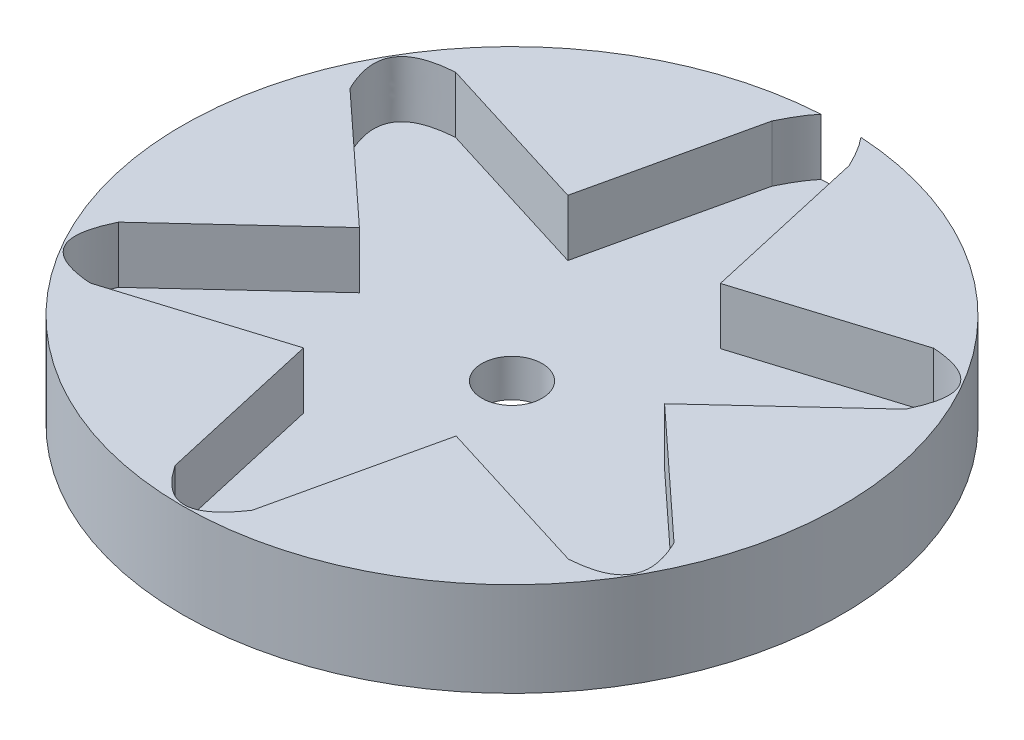
ISO-10303-21;
HEADER;
FILE_DESCRIPTION(('STEP AP214'),'2;1');
FILE_NAME('part.step','',(''),(''),'','','');
FILE_SCHEMA(('AUTOMOTIVE_DESIGN { 1 0 10303 214 1 1 1 1 }'));
ENDSEC;
DATA;
#1=APPLICATION_CONTEXT('core data for automotive mechanical design processes');
#2=APPLICATION_PROTOCOL_DEFINITION('international standard','automotive_design',2000,#1);
#3=PRODUCT_CONTEXT('',#1,'mechanical');
#4=PRODUCT('Part','Part','',(#3));
#5=PRODUCT_RELATED_PRODUCT_CATEGORY('part','',(#4));
#6=PRODUCT_DEFINITION_FORMATION('','',#4);
#7=PRODUCT_DEFINITION_CONTEXT('part definition',#1,'design');
#8=PRODUCT_DEFINITION('design','',#6,#7);
#9=PRODUCT_DEFINITION_SHAPE('','',#8);
#10=(LENGTH_UNIT() NAMED_UNIT(*) SI_UNIT(.MILLI.,.METRE.));
#11=(NAMED_UNIT(*) PLANE_ANGLE_UNIT() SI_UNIT($,.RADIAN.));
#12=(NAMED_UNIT(*) SI_UNIT($,.STERADIAN.) SOLID_ANGLE_UNIT());
#13=UNCERTAINTY_MEASURE_WITH_UNIT(LENGTH_MEASURE(1.E-05),#10,'distance_accuracy_value','');
#14=(GEOMETRIC_REPRESENTATION_CONTEXT(3) GLOBAL_UNCERTAINTY_ASSIGNED_CONTEXT((#13)) GLOBAL_UNIT_ASSIGNED_CONTEXT((#10,
#11,#12)) REPRESENTATION_CONTEXT('',''));
#15=CARTESIAN_POINT('',(0.,0.,0.));
#16=DIRECTION('',(0.,0.,1.));
#17=DIRECTION('',(1.,0.,0.));
#18=AXIS2_PLACEMENT_3D('',#15,#16,#17);
#19=CARTESIAN_POINT('',(0.,10.,0.));
#20=DIRECTION('',(0.,-1.,0.));
#21=DIRECTION('',(0.,0.,-1.));
#22=AXIS2_PLACEMENT_3D('',#19,#20,#21);
#23=CYLINDRICAL_SURFACE('',#22,17.5);
#24=CARTESIAN_POINT('',(0.,7.00000000000001,0.));
#25=DIRECTION('',(0.,-1.,0.));
#26=DIRECTION('',(0.,0.,-1.));
#27=AXIS2_PLACEMENT_3D('',#24,#25,#26);
#28=CIRCLE('',#27,17.5);
#29=CARTESIAN_POINT('',(-1.06104952952811,7.00000000000001,-17.4678039231006));
#30=VERTEX_POINT('',#29);
#31=CARTESIAN_POINT('',(1.06104952959056,7.00000000000001,-17.4678039230968));
#32=VERTEX_POINT('',#31);
#33=EDGE_CURVE('E11',#30,#32,#28,.T.);
#34=ORIENTED_EDGE('',*,*,#33,.T.);
#35=DIRECTION('',(0.,1.,0.));
#36=VECTOR('',#35,1.);
#37=CARTESIAN_POINT('',(1.06104952959056,7.00000000000001,-17.4678039230968));
#38=LINE('',#37,#36);
#39=CARTESIAN_POINT('',(1.06104952959056,10.,-17.4678039230968));
#40=VERTEX_POINT('',#39);
#41=EDGE_CURVE('E273',#32,#40,#38,.T.);
#42=ORIENTED_EDGE('',*,*,#41,.T.);
#43=CARTESIAN_POINT('',(0.,10.,0.));
#44=DIRECTION('',(0.,1.,0.));
#45=DIRECTION('',(0.,0.,1.));
#46=AXIS2_PLACEMENT_3D('',#43,#44,#45);
#47=CIRCLE('',#46,17.5);
#48=CARTESIAN_POINT('',(-1.06104952952811,10.,-17.4678039231006));
#49=VERTEX_POINT('',#48);
#50=EDGE_CURVE('E260',#49,#40,#47,.T.);
#51=ORIENTED_EDGE('',*,*,#50,.F.);
#52=DIRECTION('',(0.,1.,0.));
#53=VECTOR('',#52,1.);
#54=CARTESIAN_POINT('',(-1.06104952952811,7.00000000000001,-17.4678039231006));
#55=LINE('',#54,#53);
#56=EDGE_CURVE('E272',#49,#30,#55,.F.);
#57=ORIENTED_EDGE('',*,*,#56,.T.);
#58=EDGE_LOOP('',(#34,#42,#51,#57));
#59=FACE_BOUND('',#58,.T.);
#60=CARTESIAN_POINT('',(0.,5.,0.));
#61=DIRECTION('',(0.,-1.,0.));
#62=DIRECTION('',(0.,0.,-1.));
#63=AXIS2_PLACEMENT_3D('',#60,#61,#62);
#64=CIRCLE('',#63,17.5);
#65=CARTESIAN_POINT('',(0.,5.,-17.5));
#66=VERTEX_POINT('',#65);
#67=EDGE_CURVE('E218',#66,#66,#64,.T.);
#68=ORIENTED_EDGE('',*,*,#67,.F.);
#69=EDGE_LOOP('',(#68));
#70=FACE_BOUND('',#69,.T.);
#71=ADVANCED_FACE('F49',(#59,#70),#23,.T.);
#72=CARTESIAN_POINT('',(0.,10.,0.));
#73=DIRECTION('',(0.,1.,0.));
#74=DIRECTION('',(0.,0.,1.));
#75=AXIS2_PLACEMENT_3D('',#72,#73,#74);
#76=PLANE('',#75);
#77=CARTESIAN_POINT('',(2.05053814510281,10.,-15.8532222673604));
#78=CARTESIAN_POINT('',(1.23713778191181,10.,-17.5523034470157));
#79=CARTESIAN_POINT('',(3.05311331771918E-11,10.,-18.2086801576229));
#80=CARTESIAN_POINT('',(-1.23713778185253,10.,-17.552303447016));
#81=CARTESIAN_POINT('',(-2.05053814504663,10.,-15.8532222673604));
#82=B_SPLINE_CURVE_WITH_KNOTS('',2,(#77,#78,#79,#80,#81),.UNSPECIFIED.,.F.,.F.,(3,1,1,3),
(0.00107426854361692,0.375268567135908,0.624731432864102,0.998925731456393),.UNSPECIFIED.);
#83=CARTESIAN_POINT('',(-2.05053814504663,10.,-15.8532222673604));
#84=VERTEX_POINT('',#83);
#85=EDGE_CURVE('E58',#49,#84,#82,.T.);
#86=ORIENTED_EDGE('',*,*,#85,.F.);
#87=ORIENTED_EDGE('',*,*,#50,.T.);
#88=CARTESIAN_POINT('',(2.05053814510281,10.,-15.8532222673604));
#89=CARTESIAN_POINT('',(1.23713778191181,10.,-17.5523034470157));
#90=CARTESIAN_POINT('',(3.05311331771918E-11,10.,-18.2086801576229));
#91=CARTESIAN_POINT('',(-1.23713778185253,10.,-17.552303447016));
#92=CARTESIAN_POINT('',(-2.05053814504663,10.,-15.8532222673604));
#93=B_SPLINE_CURVE_WITH_KNOTS('',2,(#88,#89,#90,#91,#92),.UNSPECIFIED.,.F.,.F.,(3,1,1,3),
(0.00107426854361692,0.375268567135908,0.624731432864102,0.998925731456393),.UNSPECIFIED.);
#94=CARTESIAN_POINT('',(2.05053814510281,10.,-15.8532222673606));
#95=VERTEX_POINT('',#94);
#96=EDGE_CURVE('E346',#95,#40,#93,.T.);
#97=ORIENTED_EDGE('',*,*,#96,.F.);
#98=DIRECTION('',(-0.220846052867144,0.,-0.975308679820395));
#99=VECTOR('',#98,1.);
#100=CARTESIAN_POINT('',(4.05135282122782,10.,-7.01714892576155));
#101=LINE('',#100,#99);
#102=CARTESIAN_POINT('',(4.05135282122782,10.,-7.01714892576155));
#103=VERTEX_POINT('',#102);
#104=EDGE_CURVE('E350',#103,#95,#101,.T.);
#105=ORIENTED_EDGE('',*,*,#104,.F.);
#106=DIRECTION('',(-0.955065119689509,0.,0.296396047801693));
#107=VECTOR('',#106,1.);
#108=CARTESIAN_POINT('',(12.6967320380275,10.,-9.70016621827807));
#109=LINE('',#108,#107);
#110=CARTESIAN_POINT('',(12.6967320380275,10.,-9.70016621827807));
#111=VERTEX_POINT('',#110);
#112=EDGE_CURVE('E357',#111,#103,#109,.T.);
#113=ORIENTED_EDGE('',*,*,#112,.F.);
#114=CARTESIAN_POINT('',(14.7489563849404,10.,-6.14560938089559));
#115=CARTESIAN_POINT('',(15.3726854341846,10.,-7.42841556478302));
#116=CARTESIAN_POINT('',(15.149524439763,10.,-8.74658201343403));
#117=CARTESIAN_POINT('',(14.1195393060261,10.,-9.59892832806064));
#118=CARTESIAN_POINT('',(12.6967320380275,10.,-9.70016621827807));
#119=B_SPLINE_CURVE_WITH_KNOTS('',2,(#114,#115,#116,#117,#118),.UNSPECIFIED.,.F.,.F.,(3,1,1,3),
(0.00239909876569032,0.375599774691409,0.624400225308554,0.997600901234272),.UNSPECIFIED.);
#120=CARTESIAN_POINT('',(14.7489563849397,10.,-6.14560938089537));
#121=VERTEX_POINT('',#120);
#122=EDGE_CURVE('E361',#121,#111,#119,.T.);
#123=ORIENTED_EDGE('',*,*,#122,.F.);
#124=DIRECTION('',(0.73421906682237,0.,-0.678912632018648));
#125=VECTOR('',#124,1.);
#126=CARTESIAN_POINT('',(8.10270564242743,10.,-5.57331958361829E-11));
#127=LINE('',#126,#125);
#128=CARTESIAN_POINT('',(8.10270564242743,10.,-5.57331958361829E-11));
#129=VERTEX_POINT('',#128);
#130=EDGE_CURVE('E367',#129,#121,#127,.T.);
#131=ORIENTED_EDGE('',*,*,#130,.F.);
#132=DIRECTION('',(-0.734219066822367,0.,-0.678912632018651));
#133=VECTOR('',#132,1.);
#134=CARTESIAN_POINT('',(14.7489563849403,10.,6.14560938078457));
#135=LINE('',#134,#133);
#136=CARTESIAN_POINT('',(14.7489563849403,10.,6.14560938078457));
#137=VERTEX_POINT('',#136);
#138=EDGE_CURVE('E374',#137,#129,#135,.T.);
#139=ORIENTED_EDGE('',*,*,#138,.F.);
#140=CARTESIAN_POINT('',(12.6967320380278,10.,9.70016621816705));
#141=CARTESIAN_POINT('',(14.1195393060658,10.,9.59892832796583));
#142=CARTESIAN_POINT('',(15.1495244398164,10.,8.74658201334766));
#143=CARTESIAN_POINT('',(15.3726854342223,10.,7.42841556469109));
#144=CARTESIAN_POINT('',(14.7489563849403,10.,6.14560938078457));
#145=B_SPLINE_CURVE_WITH_KNOTS('',2,(#140,#141,#142,#143,#144),.UNSPECIFIED.,.F.,.F.,(3,1,1,3),
(0.00239909876554578,0.375599774691407,0.624400225308648,0.997600901234509),.UNSPECIFIED.);
#146=CARTESIAN_POINT('',(12.6967320380278,10.,9.70016621816705));
#147=VERTEX_POINT('',#146);
#148=EDGE_CURVE('E378',#147,#137,#145,.T.);
#149=ORIENTED_EDGE('',*,*,#148,.F.);
#150=DIRECTION('',(0.95506511968948,0.,0.296396047801788));
#151=VECTOR('',#150,1.);
#152=CARTESIAN_POINT('',(4.05135282122759,10.,7.01714892564942));
#153=LINE('',#152,#151);
#154=CARTESIAN_POINT('',(4.05135282122759,10.,7.01714892564942));
#155=VERTEX_POINT('',#154);
#156=EDGE_CURVE('E384',#155,#147,#153,.T.);
#157=ORIENTED_EDGE('',*,*,#156,.F.);
#158=DIRECTION('',(0.220846052867143,0.,-0.975308679820395));
#159=VECTOR('',#158,1.);
#160=CARTESIAN_POINT('',(2.05222434693997,10.,15.845775599008));
#161=LINE('',#160,#159);
#162=CARTESIAN_POINT('',(2.05222434693997,10.,15.845775599008));
#163=VERTEX_POINT('',#162);
#164=EDGE_CURVE('E391',#163,#155,#161,.T.);
#165=ORIENTED_EDGE('',*,*,#164,.F.);
#166=CARTESIAN_POINT('',(-2.05222434688435,10.,15.845775599008));
#167=CARTESIAN_POINT('',(-1.25314612813476,10.,17.0273438927573));
#168=CARTESIAN_POINT('',(1.66533453693773E-11,10.,17.4931640268106));
#169=CARTESIAN_POINT('',(1.25314612817518,10.,17.0273438927571));
#170=CARTESIAN_POINT('',(2.05222434693997,10.,15.845775599008));
#171=B_SPLINE_CURVE_WITH_KNOTS('',2,(#166,#167,#168,#169,#170),.UNSPECIFIED.,.F.,.F.,(3,1,1,3),
(0.00239909876539665,0.375599774691334,0.624400225308626,0.997600901234563),.UNSPECIFIED.);
#172=CARTESIAN_POINT('',(-2.05222434688435,10.,15.8457755990085));
#173=VERTEX_POINT('',#172);
#174=EDGE_CURVE('E395',#173,#163,#171,.T.);
#175=ORIENTED_EDGE('',*,*,#174,.F.);
#176=DIRECTION('',(0.220846052867121,0.,0.975308679820401));
#177=VECTOR('',#176,1.);
#178=CARTESIAN_POINT('',(-4.05135282117186,10.,7.01714892564942));
#179=LINE('',#178,#177);
#180=CARTESIAN_POINT('',(-4.05135282117186,10.,7.01714892564942));
#181=VERTEX_POINT('',#180);
#182=EDGE_CURVE('E401',#181,#173,#179,.T.);
#183=ORIENTED_EDGE('',*,*,#182,.F.);
#184=DIRECTION('',(0.955065119689503,0.,-0.296396047801714));
#185=VECTOR('',#184,1.);
#186=CARTESIAN_POINT('',(-12.6967320379737,10.,9.70016621816683));
#187=LINE('',#186,#185);
#188=CARTESIAN_POINT('',(-12.6967320379737,10.,9.70016621816683));
#189=VERTEX_POINT('',#188);
#190=EDGE_CURVE('E408',#189,#181,#187,.T.);
#191=ORIENTED_EDGE('',*,*,#190,.F.);
#192=CARTESIAN_POINT('',(-14.748956384886,10.,6.14560938078523));
#193=CARTESIAN_POINT('',(-15.3726854341882,10.,7.42841556472973));
#194=CARTESIAN_POINT('',(-15.14952443979,10.,8.74658201339984));
#195=CARTESIAN_POINT('',(-14.119539306033,10.,9.59892832800247));
#196=CARTESIAN_POINT('',(-12.6967320379737,10.,9.70016621816683));
#197=B_SPLINE_CURVE_WITH_KNOTS('',2,(#192,#193,#194,#195,#196),.UNSPECIFIED.,.F.,.F.,(3,1,1,3),
(0.0023990987654635,0.375599774691405,0.624400225308699,0.99760090123464),.UNSPECIFIED.);
#198=CARTESIAN_POINT('',(-14.7489563848848,10.,6.14560938078457));
#199=VERTEX_POINT('',#198);
#200=EDGE_CURVE('E412',#199,#189,#197,.T.);
#201=ORIENTED_EDGE('',*,*,#200,.F.);
#202=DIRECTION('',(-0.73421906682236,0.,0.678912632018659));
#203=VECTOR('',#202,1.);
#204=CARTESIAN_POINT('',(-8.10270564237159,10.,-5.61772850460329E-11));
#205=LINE('',#204,#203);
#206=CARTESIAN_POINT('',(-8.10270564237159,10.,-5.61772850460329E-11));
#207=VERTEX_POINT('',#206);
#208=EDGE_CURVE('E418',#207,#199,#205,.T.);
#209=ORIENTED_EDGE('',*,*,#208,.F.);
#210=DIRECTION('',(0.734219066822346,0.,0.678912632018673));
#211=VECTOR('',#210,1.);
#212=CARTESIAN_POINT('',(-14.748956384885,10.,-6.14560938089737));
#213=LINE('',#212,#211);
#214=CARTESIAN_POINT('',(-14.748956384885,10.,-6.14560938089737));
#215=VERTEX_POINT('',#214);
#216=EDGE_CURVE('E65',#215,#207,#213,.T.);
#217=ORIENTED_EDGE('',*,*,#216,.F.);
#218=CARTESIAN_POINT('',(-12.6967320379726,10.,-9.70016621827963));
#219=CARTESIAN_POINT('',(-14.1195393060227,10.,-9.59892832804754));
#220=CARTESIAN_POINT('',(-15.1495244397788,10.,-8.74658201341405));
#221=CARTESIAN_POINT('',(-15.3726854341788,10.,-7.42841556477147));
#222=CARTESIAN_POINT('',(-14.748956384885,10.,-6.14560938089737));
#223=B_SPLINE_CURVE_WITH_KNOTS('',2,(#218,#219,#220,#221,#222),.UNSPECIFIED.,.F.,.F.,(3,1,1,3),
(0.00239909876565966,0.375599774691492,0.624400225308713,0.997600901234545),.UNSPECIFIED.);
#224=CARTESIAN_POINT('',(-12.6967320379707,10.,-9.70016621827852));
#225=VERTEX_POINT('',#224);
#226=EDGE_CURVE('E209',#225,#215,#223,.T.);
#227=ORIENTED_EDGE('',*,*,#226,.F.);
#228=DIRECTION('',(-0.95506511968949,0.,-0.296396047801756));
#229=VECTOR('',#228,1.);
#230=CARTESIAN_POINT('',(-4.05135282117164,10.,-7.01714892576155));
#231=LINE('',#230,#229);
#232=CARTESIAN_POINT('',(-4.05135282117164,10.,-7.01714892576155));
#233=VERTEX_POINT('',#232);
#234=EDGE_CURVE('E215',#233,#225,#231,.T.);
#235=ORIENTED_EDGE('',*,*,#234,.F.);
#236=DIRECTION('',(-0.220846052867149,0.,0.975308679820394));
#237=VECTOR('',#236,1.);
#238=CARTESIAN_POINT('',(-2.05053814504663,10.,-15.8532222673604));
#239=LINE('',#238,#237);
#240=EDGE_CURVE('E263',#84,#233,#239,.T.);
#241=ORIENTED_EDGE('',*,*,#240,.F.);
#242=EDGE_LOOP('',(#86,#87,#97,#105,#113,#123,#131,#139,#149,#157,#165,#175,#183,#191,#201,#209,
#217,#227,#235,#241));
#243=FACE_BOUND('',#242,.T.);
#244=ADVANCED_FACE('F245',(#243),#76,.T.);
#245=CARTESIAN_POINT('',(-15.0688420258541,7.00000000000001,8.69999999999309));
#246=DIRECTION('',(0.,-1.,0.));
#247=DIRECTION('',(0.,0.,-1.));
#248=AXIS2_PLACEMENT_3D('',#245,#246,#247);
#249=PLANE('',#248);
#250=CARTESIAN_POINT('',(0.,7.00000000000001,0.));
#251=DIRECTION('',(0.,1.,0.));
#252=DIRECTION('',(0.,0.,1.));
#253=AXIS2_PLACEMENT_3D('',#250,#251,#252);
#254=CIRCLE('',#253,1.6);
#255=CARTESIAN_POINT('',(0.,7.00000000000001,1.6));
#256=VERTEX_POINT('',#255);
#257=EDGE_CURVE('E719',#256,#256,#254,.T.);
#258=ORIENTED_EDGE('',*,*,#257,.F.);
#259=EDGE_LOOP('',(#258));
#260=FACE_BOUND('',#259,.T.);
#261=CARTESIAN_POINT('',(2.05053814510281,7.00000000000001,-15.8532222673604));
#262=CARTESIAN_POINT('',(1.23713778191181,7.00000000000001,-17.5523034470157));
#263=CARTESIAN_POINT('',(3.05311331771918E-11,7.00000000000001,-18.2086801576229));
#264=CARTESIAN_POINT('',(-1.23713778185253,7.00000000000001,-17.552303447016));
#265=CARTESIAN_POINT('',(-2.05053814504663,7.00000000000001,-15.8532222673604));
#266=B_SPLINE_CURVE_WITH_KNOTS('',2,(#261,#262,#263,#264,#265),.UNSPECIFIED.,.F.,.F.,(3,1,1,3),
(0.00107426854361692,0.375268567135908,0.624731432864102,0.998925731456393),.UNSPECIFIED.);
#267=CARTESIAN_POINT('',(-2.05053814504663,7.00000000000001,-15.8532222673604));
#268=VERTEX_POINT('',#267);
#269=EDGE_CURVE('E462',#30,#268,#266,.T.);
#270=ORIENTED_EDGE('',*,*,#269,.T.);
#271=DIRECTION('',(-0.220846052867149,0.,0.975308679820394));
#272=VECTOR('',#271,1.);
#273=CARTESIAN_POINT('',(-2.05053814504663,7.00000000000001,-15.8532222673604));
#274=LINE('',#273,#272);
#275=CARTESIAN_POINT('',(-4.05135282117164,7.00000000000001,-7.01714892576155));
#276=VERTEX_POINT('',#275);
#277=EDGE_CURVE('E461',#268,#276,#274,.T.);
#278=ORIENTED_EDGE('',*,*,#277,.T.);
#279=DIRECTION('',(-0.95506511968949,0.,-0.296396047801756));
#280=VECTOR('',#279,1.);
#281=CARTESIAN_POINT('',(-4.05135282117164,7.00000000000001,-7.01714892576155));
#282=LINE('',#281,#280);
#283=CARTESIAN_POINT('',(-12.6967320379707,7.00000000000001,-9.70016621827852));
#284=VERTEX_POINT('',#283);
#285=EDGE_CURVE('E431',#276,#284,#282,.T.);
#286=ORIENTED_EDGE('',*,*,#285,.T.);
#287=CARTESIAN_POINT('',(-12.6967320379726,7.00000000000001,-9.70016621827963));
#288=CARTESIAN_POINT('',(-14.1195393060227,7.00000000000001,-9.59892832804754));
#289=CARTESIAN_POINT('',(-15.1495244397788,7.00000000000001,-8.74658201341405));
#290=CARTESIAN_POINT('',(-15.3726854341788,7.00000000000001,-7.42841556477147));
#291=CARTESIAN_POINT('',(-14.748956384885,7.00000000000001,-6.14560938089737));
#292=B_SPLINE_CURVE_WITH_KNOTS('',2,(#287,#288,#289,#290,#291),.UNSPECIFIED.,.F.,.F.,(3,1,1,3),
(0.00239909876565966,0.375599774691492,0.624400225308713,0.997600901234545),.UNSPECIFIED.);
#293=CARTESIAN_POINT('',(-14.748956384885,7.00000000000001,-6.14560938089737));
#294=VERTEX_POINT('',#293);
#295=EDGE_CURVE('E195',#284,#294,#292,.T.);
#296=ORIENTED_EDGE('',*,*,#295,.T.);
#297=DIRECTION('',(0.734219066822346,0.,0.678912632018673));
#298=VECTOR('',#297,1.);
#299=CARTESIAN_POINT('',(-14.748956384885,7.00000000000001,-6.14560938089737));
#300=LINE('',#299,#298);
#301=CARTESIAN_POINT('',(-8.10270564237159,7.00000000000001,-5.61772850460329E-11));
#302=VERTEX_POINT('',#301);
#303=EDGE_CURVE('E188',#294,#302,#300,.T.);
#304=ORIENTED_EDGE('',*,*,#303,.T.);
#305=DIRECTION('',(-0.73421906682236,0.,0.678912632018659));
#306=VECTOR('',#305,1.);
#307=CARTESIAN_POINT('',(-8.10270564237159,7.00000000000001,-5.61772850460329E-11));
#308=LINE('',#307,#306);
#309=CARTESIAN_POINT('',(-14.7489563848848,7.00000000000001,6.14560938078457));
#310=VERTEX_POINT('',#309);
#311=EDGE_CURVE('E198',#302,#310,#308,.T.);
#312=ORIENTED_EDGE('',*,*,#311,.T.);
#313=CARTESIAN_POINT('',(-14.748956384886,7.00000000000001,6.14560938078523));
#314=CARTESIAN_POINT('',(-15.3726854341882,7.00000000000001,7.42841556472973));
#315=CARTESIAN_POINT('',(-15.14952443979,7.00000000000001,8.74658201339984));
#316=CARTESIAN_POINT('',(-14.119539306033,7.00000000000001,9.59892832800247));
#317=CARTESIAN_POINT('',(-12.6967320379737,7.00000000000001,9.70016621816683));
#318=B_SPLINE_CURVE_WITH_KNOTS('',2,(#313,#314,#315,#316,#317),.UNSPECIFIED.,.F.,.F.,(3,1,1,3),
(0.0023990987654635,0.375599774691405,0.624400225308699,0.99760090123464),.UNSPECIFIED.);
#319=CARTESIAN_POINT('',(-12.6967320379737,7.00000000000001,9.70016621816683));
#320=VERTEX_POINT('',#319);
#321=EDGE_CURVE('E203',#310,#320,#318,.T.);
#322=ORIENTED_EDGE('',*,*,#321,.T.);
#323=DIRECTION('',(0.955065119689503,0.,-0.296396047801714));
#324=VECTOR('',#323,1.);
#325=CARTESIAN_POINT('',(-12.6967320379737,7.00000000000001,9.70016621816683));
#326=LINE('',#325,#324);
#327=CARTESIAN_POINT('',(-4.05135282117186,7.00000000000001,7.01714892564942));
#328=VERTEX_POINT('',#327);
#329=EDGE_CURVE('E226',#320,#328,#326,.T.);
#330=ORIENTED_EDGE('',*,*,#329,.T.);
#331=DIRECTION('',(0.220846052867121,0.,0.975308679820401));
#332=VECTOR('',#331,1.);
#333=CARTESIAN_POINT('',(-4.05135282117186,7.00000000000001,7.01714892564942));
#334=LINE('',#333,#332);
#335=CARTESIAN_POINT('',(-2.05222434688435,7.00000000000001,15.8457755990085));
#336=VERTEX_POINT('',#335);
#337=EDGE_CURVE('E483',#328,#336,#334,.T.);
#338=ORIENTED_EDGE('',*,*,#337,.T.);
#339=CARTESIAN_POINT('',(-2.05222434688435,7.00000000000001,15.845775599008));
#340=CARTESIAN_POINT('',(-1.25314612813476,7.00000000000001,17.0273438927573));
#341=CARTESIAN_POINT('',(1.66533453693773E-11,7.00000000000001,17.4931640268106));
#342=CARTESIAN_POINT('',(1.25314612817518,7.00000000000001,17.0273438927571));
#343=CARTESIAN_POINT('',(2.05222434693997,7.00000000000001,15.845775599008));
#344=B_SPLINE_CURVE_WITH_KNOTS('',2,(#339,#340,#341,#342,#343),.UNSPECIFIED.,.F.,.F.,(3,1,1,3),
(0.00239909876539665,0.375599774691334,0.624400225308626,0.997600901234563),.UNSPECIFIED.);
#345=CARTESIAN_POINT('',(2.05222434693997,7.00000000000001,15.845775599008));
#346=VERTEX_POINT('',#345);
#347=EDGE_CURVE('E487',#336,#346,#344,.T.);
#348=ORIENTED_EDGE('',*,*,#347,.T.);
#349=DIRECTION('',(0.220846052867143,0.,-0.975308679820395));
#350=VECTOR('',#349,1.);
#351=CARTESIAN_POINT('',(2.05222434693997,7.00000000000001,15.845775599008));
#352=LINE('',#351,#350);
#353=CARTESIAN_POINT('',(4.05135282122759,7.00000000000001,7.01714892564942));
#354=VERTEX_POINT('',#353);
#355=EDGE_CURVE('E489',#346,#354,#352,.T.);
#356=ORIENTED_EDGE('',*,*,#355,.T.);
#357=DIRECTION('',(0.95506511968948,0.,0.296396047801788));
#358=VECTOR('',#357,1.);
#359=CARTESIAN_POINT('',(4.05135282122759,7.00000000000001,7.01714892564942));
#360=LINE('',#359,#358);
#361=CARTESIAN_POINT('',(12.6967320380278,7.00000000000001,9.70016621816705));
#362=VERTEX_POINT('',#361);
#363=EDGE_CURVE('E520',#354,#362,#360,.T.);
#364=ORIENTED_EDGE('',*,*,#363,.T.);
#365=CARTESIAN_POINT('',(12.6967320380278,7.00000000000001,9.70016621816705));
#366=CARTESIAN_POINT('',(14.1195393060658,7.00000000000001,9.59892832796583));
#367=CARTESIAN_POINT('',(15.1495244398164,7.00000000000001,8.74658201334766));
#368=CARTESIAN_POINT('',(15.3726854342223,7.00000000000001,7.42841556469109));
#369=CARTESIAN_POINT('',(14.7489563849403,7.00000000000001,6.14560938078457));
#370=B_SPLINE_CURVE_WITH_KNOTS('',2,(#365,#366,#367,#368,#369),.UNSPECIFIED.,.F.,.F.,(3,1,1,3),
(0.00239909876554578,0.375599774691407,0.624400225308648,0.997600901234509),.UNSPECIFIED.);
#371=CARTESIAN_POINT('',(14.7489563849403,7.00000000000001,6.14560938078457));
#372=VERTEX_POINT('',#371);
#373=EDGE_CURVE('E525',#362,#372,#370,.T.);
#374=ORIENTED_EDGE('',*,*,#373,.T.);
#375=DIRECTION('',(-0.734219066822367,0.,-0.678912632018651));
#376=VECTOR('',#375,1.);
#377=CARTESIAN_POINT('',(14.7489563849403,7.00000000000001,6.14560938078457));
#378=LINE('',#377,#376);
#379=CARTESIAN_POINT('',(8.10270564242743,7.00000000000001,-5.57331958361829E-11));
#380=VERTEX_POINT('',#379);
#381=EDGE_CURVE('E527',#372,#380,#378,.T.);
#382=ORIENTED_EDGE('',*,*,#381,.T.);
#383=DIRECTION('',(0.73421906682237,0.,-0.678912632018648));
#384=VECTOR('',#383,1.);
#385=CARTESIAN_POINT('',(8.10270564242743,7.00000000000001,-5.57331958361829E-11));
#386=LINE('',#385,#384);
#387=CARTESIAN_POINT('',(14.7489563849397,7.00000000000001,-6.14560938089537));
#388=VERTEX_POINT('',#387);
#389=EDGE_CURVE('E558',#380,#388,#386,.T.);
#390=ORIENTED_EDGE('',*,*,#389,.T.);
#391=CARTESIAN_POINT('',(14.7489563849404,7.00000000000001,-6.14560938089559));
#392=CARTESIAN_POINT('',(15.3726854341846,7.00000000000001,-7.42841556478302));
#393=CARTESIAN_POINT('',(15.149524439763,7.00000000000001,-8.74658201343403));
#394=CARTESIAN_POINT('',(14.1195393060261,7.00000000000001,-9.59892832806064));
#395=CARTESIAN_POINT('',(12.6967320380275,7.00000000000001,-9.70016621827807));
#396=B_SPLINE_CURVE_WITH_KNOTS('',2,(#391,#392,#393,#394,#395),.UNSPECIFIED.,.F.,.F.,(3,1,1,3),
(0.00239909876569032,0.375599774691409,0.624400225308554,0.997600901234272),.UNSPECIFIED.);
#397=CARTESIAN_POINT('',(12.6967320380275,7.00000000000001,-9.70016621827807));
#398=VERTEX_POINT('',#397);
#399=EDGE_CURVE('E563',#388,#398,#396,.T.);
#400=ORIENTED_EDGE('',*,*,#399,.T.);
#401=DIRECTION('',(-0.955065119689509,0.,0.296396047801693));
#402=VECTOR('',#401,1.);
#403=CARTESIAN_POINT('',(12.6967320380275,7.00000000000001,-9.70016621827807));
#404=LINE('',#403,#402);
#405=CARTESIAN_POINT('',(4.05135282122782,7.00000000000001,-7.01714892576155));
#406=VERTEX_POINT('',#405);
#407=EDGE_CURVE('E564',#398,#406,#404,.T.);
#408=ORIENTED_EDGE('',*,*,#407,.T.);
#409=DIRECTION('',(-0.220846052867144,0.,-0.975308679820395));
#410=VECTOR('',#409,1.);
#411=CARTESIAN_POINT('',(4.05135282122782,7.00000000000001,-7.01714892576155));
#412=LINE('',#411,#410);
#413=CARTESIAN_POINT('',(2.05053814510281,7.00000000000001,-15.8532222673606));
#414=VERTEX_POINT('',#413);
#415=EDGE_CURVE('E463',#406,#414,#412,.T.);
#416=ORIENTED_EDGE('',*,*,#415,.T.);
#417=EDGE_CURVE('E455',#414,#32,#266,.T.);
#418=ORIENTED_EDGE('',*,*,#417,.T.);
#419=ORIENTED_EDGE('',*,*,#33,.F.);
#420=EDGE_LOOP('',(#270,#278,#286,#296,#304,#312,#322,#330,#338,#348,#356,#364,#374,#382,#390,
#400,#408,#416,#418,#419));
#421=FACE_BOUND('',#420,.T.);
#422=ADVANCED_FACE('F205',(#260,#421),#249,.F.);
#423=DIRECTION('',(0.,1.,0.));
#424=VECTOR('',#423,1.);
#425=SURFACE_OF_LINEAR_EXTRUSION('',#266,#424);
#426=ORIENTED_EDGE('',*,*,#417,.F.);
#427=DIRECTION('',(0.,1.,0.));
#428=VECTOR('',#427,1.);
#429=CARTESIAN_POINT('',(2.05053814510281,7.00000000000001,-15.8532222673606));
#430=LINE('',#429,#428);
#431=EDGE_CURVE('E323',#414,#95,#430,.T.);
#432=ORIENTED_EDGE('',*,*,#431,.T.);
#433=ORIENTED_EDGE('',*,*,#96,.T.);
#434=ORIENTED_EDGE('',*,*,#41,.F.);
#435=EDGE_LOOP('',(#426,#432,#433,#434));
#436=FACE_BOUND('',#435,.T.);
#437=ADVANCED_FACE('F251',(#436),#425,.F.);
#438=ORIENTED_EDGE('',*,*,#85,.T.);
#439=DIRECTION('',(0.,1.,0.));
#440=VECTOR('',#439,1.);
#441=CARTESIAN_POINT('',(-2.05053814504663,7.00000000000001,-15.8532222673604));
#442=LINE('',#441,#440);
#443=EDGE_CURVE('E326',#268,#84,#442,.T.);
#444=ORIENTED_EDGE('',*,*,#443,.F.);
#445=ORIENTED_EDGE('',*,*,#269,.F.);
#446=ORIENTED_EDGE('',*,*,#56,.F.);
#447=EDGE_LOOP('',(#438,#444,#445,#446));
#448=FACE_BOUND('',#447,.T.);
#449=ADVANCED_FACE('F244',(#448),#425,.F.);
#450=CARTESIAN_POINT('',(-14.748956384885,7.00000000000001,-6.14560938089737));
#451=DIRECTION('',(-0.678912632018673,0.,0.734219066822346));
#452=DIRECTION('',(0.734219066822346,0.,0.678912632018673));
#453=AXIS2_PLACEMENT_3D('',#450,#451,#452);
#454=PLANE('',#453);
#455=ORIENTED_EDGE('',*,*,#216,.T.);
#456=DIRECTION('',(0.,1.,0.));
#457=VECTOR('',#456,1.);
#458=CARTESIAN_POINT('',(-8.10270564237159,7.00000000000001,-5.61772850460329E-11));
#459=LINE('',#458,#457);
#460=EDGE_CURVE('E184',#302,#207,#459,.T.);
#461=ORIENTED_EDGE('',*,*,#460,.F.);
#462=ORIENTED_EDGE('',*,*,#303,.F.);
#463=DIRECTION('',(0.,1.,0.));
#464=VECTOR('',#463,1.);
#465=CARTESIAN_POINT('',(-14.748956384885,7.00000000000001,-6.14560938089737));
#466=LINE('',#465,#464);
#467=EDGE_CURVE('E287',#294,#215,#466,.T.);
#468=ORIENTED_EDGE('',*,*,#467,.T.);
#469=EDGE_LOOP('',(#455,#461,#462,#468));
#470=FACE_BOUND('',#469,.T.);
#471=ADVANCED_FACE('F186',(#470),#454,.F.);
#472=DIRECTION('',(0.,1.,0.));
#473=VECTOR('',#472,1.);
#474=SURFACE_OF_LINEAR_EXTRUSION('',#292,#473);
#475=ORIENTED_EDGE('',*,*,#226,.T.);
#476=ORIENTED_EDGE('',*,*,#467,.F.);
#477=ORIENTED_EDGE('',*,*,#295,.F.);
#478=DIRECTION('',(0.,1.,0.));
#479=VECTOR('',#478,1.);
#480=CARTESIAN_POINT('',(-12.6967320379707,7.00000000000001,-9.70016621827852));
#481=LINE('',#480,#479);
#482=EDGE_CURVE('E332',#284,#225,#481,.T.);
#483=ORIENTED_EDGE('',*,*,#482,.T.);
#484=EDGE_LOOP('',(#475,#476,#477,#483));
#485=FACE_BOUND('',#484,.T.);
#486=ADVANCED_FACE('F243',(#485),#474,.F.);
#487=CARTESIAN_POINT('',(-4.05135282117164,7.00000000000001,-7.01714892576155));
#488=DIRECTION('',(0.296396047801755,0.,-0.95506511968949));
#489=DIRECTION('',(-0.95506511968949,0.,-0.296396047801756));
#490=AXIS2_PLACEMENT_3D('',#487,#488,#489);
#491=PLANE('',#490);
#492=ORIENTED_EDGE('',*,*,#234,.T.);
#493=ORIENTED_EDGE('',*,*,#482,.F.);
#494=ORIENTED_EDGE('',*,*,#285,.F.);
#495=DIRECTION('',(0.,1.,0.));
#496=VECTOR('',#495,1.);
#497=CARTESIAN_POINT('',(-4.05135282117164,7.00000000000001,-7.01714892576155));
#498=LINE('',#497,#496);
#499=EDGE_CURVE('E329',#276,#233,#498,.T.);
#500=ORIENTED_EDGE('',*,*,#499,.T.);
#501=EDGE_LOOP('',(#492,#493,#494,#500));
#502=FACE_BOUND('',#501,.T.);
#503=ADVANCED_FACE('F439',(#502),#491,.F.);
#504=CARTESIAN_POINT('',(-2.05053814504663,7.00000000000001,-15.8532222673604));
#505=DIRECTION('',(-0.975308679820394,0.,-0.220846052867149));
#506=DIRECTION('',(-0.220846052867149,0.,0.975308679820394));
#507=AXIS2_PLACEMENT_3D('',#504,#505,#506);
#508=PLANE('',#507);
#509=ORIENTED_EDGE('',*,*,#240,.T.);
#510=ORIENTED_EDGE('',*,*,#499,.F.);
#511=ORIENTED_EDGE('',*,*,#277,.F.);
#512=ORIENTED_EDGE('',*,*,#443,.T.);
#513=EDGE_LOOP('',(#509,#510,#511,#512));
#514=FACE_BOUND('',#513,.T.);
#515=ADVANCED_FACE('F444',(#514),#508,.F.);
#516=CARTESIAN_POINT('',(4.05135282122782,7.00000000000001,-7.01714892576155));
#517=DIRECTION('',(0.975308679820395,0.,-0.220846052867144));
#518=DIRECTION('',(-0.220846052867144,0.,-0.975308679820395));
#519=AXIS2_PLACEMENT_3D('',#516,#517,#518);
#520=PLANE('',#519);
#521=ORIENTED_EDGE('',*,*,#104,.T.);
#522=ORIENTED_EDGE('',*,*,#431,.F.);
#523=ORIENTED_EDGE('',*,*,#415,.F.);
#524=DIRECTION('',(0.,1.,0.));
#525=VECTOR('',#524,1.);
#526=CARTESIAN_POINT('',(4.05135282122782,7.00000000000001,-7.01714892576155));
#527=LINE('',#526,#525);
#528=EDGE_CURVE('E320',#406,#103,#527,.T.);
#529=ORIENTED_EDGE('',*,*,#528,.T.);
#530=EDGE_LOOP('',(#521,#522,#523,#529));
#531=FACE_BOUND('',#530,.T.);
#532=ADVANCED_FACE('F448',(#531),#520,.F.);
#533=CARTESIAN_POINT('',(12.6967320380275,7.00000000000001,-9.70016621827807));
#534=DIRECTION('',(-0.296396047801693,0.,-0.955065119689509));
#535=DIRECTION('',(-0.955065119689509,0.,0.296396047801693));
#536=AXIS2_PLACEMENT_3D('',#533,#534,#535);
#537=PLANE('',#536);
#538=ORIENTED_EDGE('',*,*,#112,.T.);
#539=ORIENTED_EDGE('',*,*,#528,.F.);
#540=ORIENTED_EDGE('',*,*,#407,.F.);
#541=DIRECTION('',(0.,1.,0.));
#542=VECTOR('',#541,1.);
#543=CARTESIAN_POINT('',(12.6967320380275,7.00000000000001,-9.70016621827807));
#544=LINE('',#543,#542);
#545=EDGE_CURVE('E317',#398,#111,#544,.T.);
#546=ORIENTED_EDGE('',*,*,#545,.T.);
#547=EDGE_LOOP('',(#538,#539,#540,#546));
#548=FACE_BOUND('',#547,.T.);
#549=ADVANCED_FACE('F576',(#548),#537,.F.);
#550=DIRECTION('',(0.,1.,0.));
#551=VECTOR('',#550,1.);
#552=SURFACE_OF_LINEAR_EXTRUSION('',#396,#551);
#553=ORIENTED_EDGE('',*,*,#122,.T.);
#554=ORIENTED_EDGE('',*,*,#545,.F.);
#555=ORIENTED_EDGE('',*,*,#399,.F.);
#556=DIRECTION('',(0.,1.,0.));
#557=VECTOR('',#556,1.);
#558=CARTESIAN_POINT('',(14.7489563849397,7.00000000000001,-6.14560938089537));
#559=LINE('',#558,#557);
#560=EDGE_CURVE('E314',#388,#121,#559,.T.);
#561=ORIENTED_EDGE('',*,*,#560,.T.);
#562=EDGE_LOOP('',(#553,#554,#555,#561));
#563=FACE_BOUND('',#562,.T.);
#564=ADVANCED_FACE('F573',(#563),#552,.F.);
#565=CARTESIAN_POINT('',(8.10270564242743,7.00000000000001,-5.57331958361829E-11));
#566=DIRECTION('',(0.678912632018648,0.,0.73421906682237));
#567=DIRECTION('',(0.73421906682237,0.,-0.678912632018648));
#568=AXIS2_PLACEMENT_3D('',#565,#566,#567);
#569=PLANE('',#568);
#570=ORIENTED_EDGE('',*,*,#130,.T.);
#571=ORIENTED_EDGE('',*,*,#560,.F.);
#572=ORIENTED_EDGE('',*,*,#389,.F.);
#573=DIRECTION('',(0.,1.,0.));
#574=VECTOR('',#573,1.);
#575=CARTESIAN_POINT('',(8.10270564242743,7.00000000000001,-5.57331958361829E-11));
#576=LINE('',#575,#574);
#577=EDGE_CURVE('E311',#380,#129,#576,.T.);
#578=ORIENTED_EDGE('',*,*,#577,.T.);
#579=EDGE_LOOP('',(#570,#571,#572,#578));
#580=FACE_BOUND('',#579,.T.);
#581=ADVANCED_FACE('F575',(#580),#569,.F.);
#582=CARTESIAN_POINT('',(14.7489563849403,7.00000000000001,6.14560938078457));
#583=DIRECTION('',(0.678912632018651,0.,-0.734219066822367));
#584=DIRECTION('',(-0.734219066822367,0.,-0.678912632018651));
#585=AXIS2_PLACEMENT_3D('',#582,#583,#584);
#586=PLANE('',#585);
#587=ORIENTED_EDGE('',*,*,#138,.T.);
#588=ORIENTED_EDGE('',*,*,#577,.F.);
#589=ORIENTED_EDGE('',*,*,#381,.F.);
#590=DIRECTION('',(0.,1.,0.));
#591=VECTOR('',#590,1.);
#592=CARTESIAN_POINT('',(14.7489563849403,7.00000000000001,6.14560938078457));
#593=LINE('',#592,#591);
#594=EDGE_CURVE('E308',#372,#137,#593,.T.);
#595=ORIENTED_EDGE('',*,*,#594,.T.);
#596=EDGE_LOOP('',(#587,#588,#589,#595));
#597=FACE_BOUND('',#596,.T.);
#598=ADVANCED_FACE('F542',(#597),#586,.F.);
#599=DIRECTION('',(0.,1.,0.));
#600=VECTOR('',#599,1.);
#601=SURFACE_OF_LINEAR_EXTRUSION('',#370,#600);
#602=ORIENTED_EDGE('',*,*,#148,.T.);
#603=ORIENTED_EDGE('',*,*,#594,.F.);
#604=ORIENTED_EDGE('',*,*,#373,.F.);
#605=DIRECTION('',(0.,1.,0.));
#606=VECTOR('',#605,1.);
#607=CARTESIAN_POINT('',(12.6967320380278,7.00000000000001,9.70016621816705));
#608=LINE('',#607,#606);
#609=EDGE_CURVE('E305',#362,#147,#608,.T.);
#610=ORIENTED_EDGE('',*,*,#609,.T.);
#611=EDGE_LOOP('',(#602,#603,#604,#610));
#612=FACE_BOUND('',#611,.T.);
#613=ADVANCED_FACE('F538',(#612),#601,.F.);
#614=CARTESIAN_POINT('',(4.05135282122759,7.00000000000001,7.01714892564942));
#615=DIRECTION('',(-0.296396047801788,0.,0.95506511968948));
#616=DIRECTION('',(0.95506511968948,0.,0.296396047801788));
#617=AXIS2_PLACEMENT_3D('',#614,#615,#616);
#618=PLANE('',#617);
#619=ORIENTED_EDGE('',*,*,#156,.T.);
#620=ORIENTED_EDGE('',*,*,#609,.F.);
#621=ORIENTED_EDGE('',*,*,#363,.F.);
#622=DIRECTION('',(0.,1.,0.));
#623=VECTOR('',#622,1.);
#624=CARTESIAN_POINT('',(4.05135282122759,7.00000000000001,7.01714892564942));
#625=LINE('',#624,#623);
#626=EDGE_CURVE('E302',#354,#155,#625,.T.);
#627=ORIENTED_EDGE('',*,*,#626,.T.);
#628=EDGE_LOOP('',(#619,#620,#621,#627));
#629=FACE_BOUND('',#628,.T.);
#630=ADVANCED_FACE('F541',(#629),#618,.F.);
#631=CARTESIAN_POINT('',(2.05222434693997,7.00000000000001,15.845775599008));
#632=DIRECTION('',(0.975308679820396,0.,0.220846052867144));
#633=DIRECTION('',(0.220846052867144,0.,-0.975308679820396));
#634=AXIS2_PLACEMENT_3D('',#631,#632,#633);
#635=PLANE('',#634);
#636=ORIENTED_EDGE('',*,*,#164,.T.);
#637=ORIENTED_EDGE('',*,*,#626,.F.);
#638=ORIENTED_EDGE('',*,*,#355,.F.);
#639=DIRECTION('',(0.,1.,0.));
#640=VECTOR('',#639,1.);
#641=CARTESIAN_POINT('',(2.05222434693997,7.00000000000001,15.845775599008));
#642=LINE('',#641,#640);
#643=EDGE_CURVE('E300',#346,#163,#642,.T.);
#644=ORIENTED_EDGE('',*,*,#643,.T.);
#645=EDGE_LOOP('',(#636,#637,#638,#644));
#646=FACE_BOUND('',#645,.T.);
#647=ADVANCED_FACE('F504',(#646),#635,.F.);
#648=DIRECTION('',(0.,1.,0.));
#649=VECTOR('',#648,1.);
#650=SURFACE_OF_LINEAR_EXTRUSION('',#344,#649);
#651=ORIENTED_EDGE('',*,*,#174,.T.);
#652=ORIENTED_EDGE('',*,*,#643,.F.);
#653=ORIENTED_EDGE('',*,*,#347,.F.);
#654=DIRECTION('',(0.,1.,0.));
#655=VECTOR('',#654,1.);
#656=CARTESIAN_POINT('',(-2.05222434688435,7.00000000000001,15.8457755990085));
#657=LINE('',#656,#655);
#658=EDGE_CURVE('E297',#336,#173,#657,.T.);
#659=ORIENTED_EDGE('',*,*,#658,.T.);
#660=EDGE_LOOP('',(#651,#652,#653,#659));
#661=FACE_BOUND('',#660,.T.);
#662=ADVANCED_FACE('F500',(#661),#650,.F.);
#663=CARTESIAN_POINT('',(-4.05135282117186,7.00000000000001,7.01714892564942));
#664=DIRECTION('',(-0.975308679820401,0.,0.220846052867121));
#665=DIRECTION('',(0.220846052867121,0.,0.975308679820401));
#666=AXIS2_PLACEMENT_3D('',#663,#664,#665);
#667=PLANE('',#666);
#668=ORIENTED_EDGE('',*,*,#182,.T.);
#669=ORIENTED_EDGE('',*,*,#658,.F.);
#670=ORIENTED_EDGE('',*,*,#337,.F.);
#671=DIRECTION('',(0.,1.,0.));
#672=VECTOR('',#671,1.);
#673=CARTESIAN_POINT('',(-4.05135282117186,7.00000000000001,7.01714892564942));
#674=LINE('',#673,#672);
#675=EDGE_CURVE('E294',#328,#181,#674,.T.);
#676=ORIENTED_EDGE('',*,*,#675,.T.);
#677=EDGE_LOOP('',(#668,#669,#670,#676));
#678=FACE_BOUND('',#677,.T.);
#679=ADVANCED_FACE('F503',(#678),#667,.F.);
#680=CARTESIAN_POINT('',(-12.6967320379737,7.00000000000001,9.70016621816683));
#681=DIRECTION('',(0.296396047801713,0.,0.955065119689503));
#682=DIRECTION('',(0.955065119689503,0.,-0.296396047801713));
#683=AXIS2_PLACEMENT_3D('',#680,#681,#682);
#684=PLANE('',#683);
#685=ORIENTED_EDGE('',*,*,#190,.T.);
#686=ORIENTED_EDGE('',*,*,#675,.F.);
#687=ORIENTED_EDGE('',*,*,#329,.F.);
#688=DIRECTION('',(0.,1.,0.));
#689=VECTOR('',#688,1.);
#690=CARTESIAN_POINT('',(-12.6967320379737,7.00000000000001,9.70016621816683));
#691=LINE('',#690,#689);
#692=EDGE_CURVE('E291',#320,#189,#691,.T.);
#693=ORIENTED_EDGE('',*,*,#692,.T.);
#694=EDGE_LOOP('',(#685,#686,#687,#693));
#695=FACE_BOUND('',#694,.T.);
#696=ADVANCED_FACE('F236',(#695),#684,.F.);
#697=DIRECTION('',(0.,1.,0.));
#698=VECTOR('',#697,1.);
#699=SURFACE_OF_LINEAR_EXTRUSION('',#318,#698);
#700=ORIENTED_EDGE('',*,*,#200,.T.);
#701=ORIENTED_EDGE('',*,*,#692,.F.);
#702=ORIENTED_EDGE('',*,*,#321,.F.);
#703=DIRECTION('',(0.,1.,0.));
#704=VECTOR('',#703,1.);
#705=CARTESIAN_POINT('',(-14.7489563848848,7.00000000000001,6.14560938078457));
#706=LINE('',#705,#704);
#707=EDGE_CURVE('E194',#310,#199,#706,.T.);
#708=ORIENTED_EDGE('',*,*,#707,.T.);
#709=EDGE_LOOP('',(#700,#701,#702,#708));
#710=FACE_BOUND('',#709,.T.);
#711=ADVANCED_FACE('F232',(#710),#699,.F.);
#712=CARTESIAN_POINT('',(-8.10270564237159,7.00000000000001,-5.61772850460329E-11));
#713=DIRECTION('',(-0.678912632018659,0.,-0.734219066822359));
#714=DIRECTION('',(-0.73421906682236,0.,0.678912632018659));
#715=AXIS2_PLACEMENT_3D('',#712,#713,#714);
#716=PLANE('',#715);
#717=ORIENTED_EDGE('',*,*,#208,.T.);
#718=ORIENTED_EDGE('',*,*,#707,.F.);
#719=ORIENTED_EDGE('',*,*,#311,.F.);
#720=ORIENTED_EDGE('',*,*,#460,.T.);
#721=EDGE_LOOP('',(#717,#718,#719,#720));
#722=FACE_BOUND('',#721,.T.);
#723=ADVANCED_FACE('F199',(#722),#716,.F.);
#724=CARTESIAN_POINT('',(0.,5.,0.));
#725=DIRECTION('',(0.,-1.,0.));
#726=DIRECTION('',(0.,0.,-1.));
#727=AXIS2_PLACEMENT_3D('',#724,#725,#726);
#728=PLANE('',#727);
#729=CARTESIAN_POINT('',(0.,5.,0.));
#730=DIRECTION('',(0.,-1.,0.));
#731=DIRECTION('',(0.,0.,-1.));
#732=AXIS2_PLACEMENT_3D('',#729,#730,#731);
#733=CIRCLE('',#732,1.6);
#734=CARTESIAN_POINT('',(0.,5.,-1.6));
#735=VERTEX_POINT('',#734);
#736=EDGE_CURVE('E52',#735,#735,#733,.T.);
#737=ORIENTED_EDGE('',*,*,#736,.F.);
#738=EDGE_LOOP('',(#737));
#739=FACE_BOUND('',#738,.T.);
#740=ORIENTED_EDGE('',*,*,#67,.T.);
#741=EDGE_LOOP('',(#740));
#742=FACE_BOUND('',#741,.T.);
#743=ADVANCED_FACE('F241',(#739,#742),#728,.T.);
#744=CARTESIAN_POINT('',(0.,2.00000000000001,0.));
#745=DIRECTION('',(0.,1.,0.));
#746=DIRECTION('',(0.,0.,1.));
#747=AXIS2_PLACEMENT_3D('',#744,#745,#746);
#748=CYLINDRICAL_SURFACE('',#747,1.6);
#749=ORIENTED_EDGE('',*,*,#736,.T.);
#750=EDGE_LOOP('',(#749));
#751=FACE_BOUND('',#750,.T.);
#752=ORIENTED_EDGE('',*,*,#257,.T.);
#753=EDGE_LOOP('',(#752));
#754=FACE_BOUND('',#753,.T.);
#755=ADVANCED_FACE('F700',(#751,#754),#748,.F.);
#756=CLOSED_SHELL('',(#71,#244,#422,#437,#449,#471,#486,#503,#515,#532,#549,#564,#581,#598,#613,
#630,#647,#662,#679,#696,#711,#723,#743,#755));
#757=MANIFOLD_SOLID_BREP('B2',#756);
#758=ADVANCED_BREP_SHAPE_REPRESENTATION('',(#18,#757),#14);
#759=SHAPE_DEFINITION_REPRESENTATION(#9,#758);
ENDSEC;
END-ISO-10303-21;
